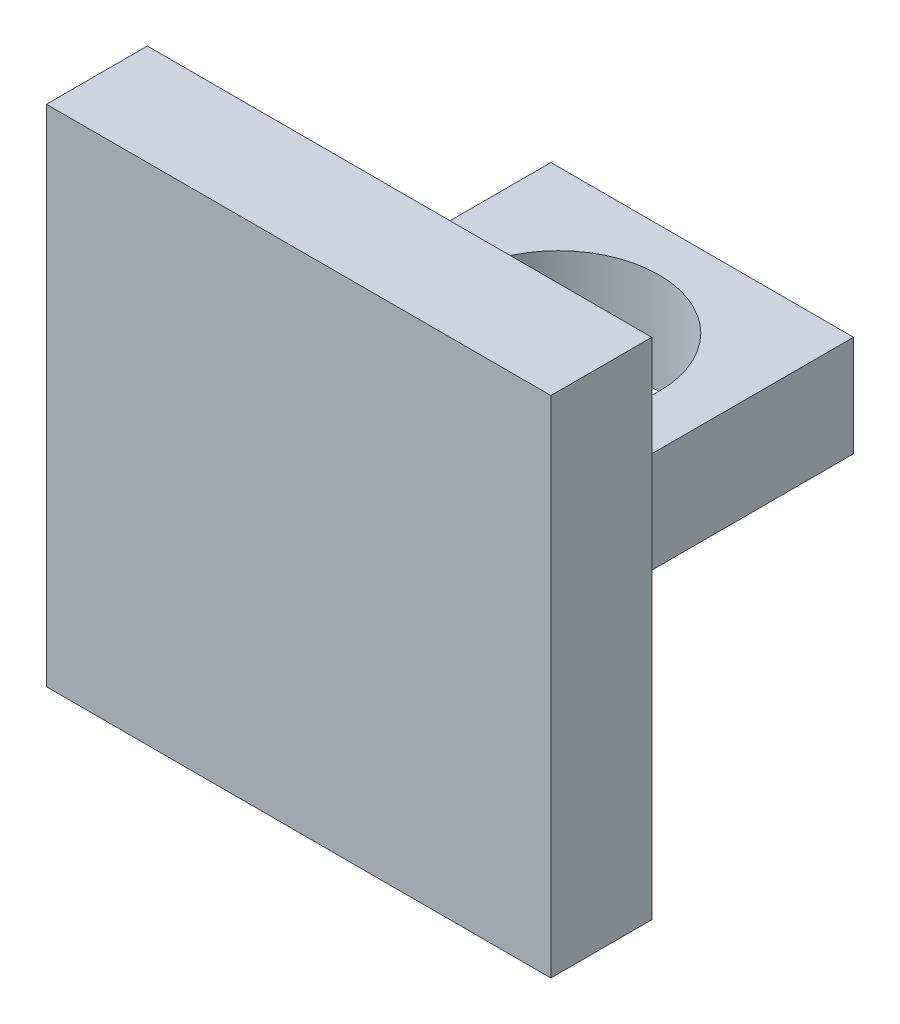
ISO-10303-21;
HEADER;
FILE_DESCRIPTION(('STEP AP214'),'2;1');
FILE_NAME('part.step','',(''),(''),'','','');
FILE_SCHEMA(('AUTOMOTIVE_DESIGN { 1 0 10303 214 1 1 1 1 }'));
ENDSEC;
DATA;
#1=APPLICATION_CONTEXT('core data for automotive mechanical design processes');
#2=APPLICATION_PROTOCOL_DEFINITION('international standard','automotive_design',2000,#1);
#3=PRODUCT_CONTEXT('',#1,'mechanical');
#4=PRODUCT('Part','Part','',(#3));
#5=PRODUCT_RELATED_PRODUCT_CATEGORY('part','',(#4));
#6=PRODUCT_DEFINITION_FORMATION('','',#4);
#7=PRODUCT_DEFINITION_CONTEXT('part definition',#1,'design');
#8=PRODUCT_DEFINITION('design','',#6,#7);
#9=PRODUCT_DEFINITION_SHAPE('','',#8);
#10=(LENGTH_UNIT() NAMED_UNIT(*) SI_UNIT(.MILLI.,.METRE.));
#11=(NAMED_UNIT(*) PLANE_ANGLE_UNIT() SI_UNIT($,.RADIAN.));
#12=(NAMED_UNIT(*) SI_UNIT($,.STERADIAN.) SOLID_ANGLE_UNIT());
#13=UNCERTAINTY_MEASURE_WITH_UNIT(LENGTH_MEASURE(1.E-05),#10,'distance_accuracy_value','');
#14=(GEOMETRIC_REPRESENTATION_CONTEXT(3) GLOBAL_UNCERTAINTY_ASSIGNED_CONTEXT((#13)) GLOBAL_UNIT_ASSIGNED_CONTEXT((#10,
#11,#12)) REPRESENTATION_CONTEXT('',''));
#15=CARTESIAN_POINT('',(0.,0.,0.));
#16=DIRECTION('',(0.,0.,1.));
#17=DIRECTION('',(1.,0.,0.));
#18=AXIS2_PLACEMENT_3D('',#15,#16,#17);
#19=CARTESIAN_POINT('',(-25.,25.,0.));
#20=DIRECTION('',(0.,0.,1.));
#21=DIRECTION('',(1.,0.,0.));
#22=AXIS2_PLACEMENT_3D('',#19,#20,#21);
#23=PLANE('',#22);
#24=DIRECTION('',(0.,-1.,0.));
#25=VECTOR('',#24,1.);
#26=CARTESIAN_POINT('',(-25.,-25.,0.));
#27=LINE('',#26,#25);
#28=CARTESIAN_POINT('',(-25.,25.,0.));
#29=VERTEX_POINT('',#28);
#30=CARTESIAN_POINT('',(-25.,-25.,0.));
#31=VERTEX_POINT('',#30);
#32=EDGE_CURVE('E118',#29,#31,#27,.T.);
#33=ORIENTED_EDGE('',*,*,#32,.F.);
#34=DIRECTION('',(-1.,0.,0.));
#35=VECTOR('',#34,1.);
#36=CARTESIAN_POINT('',(25.,25.,0.));
#37=LINE('',#36,#35);
#38=CARTESIAN_POINT('',(25.,25.,0.));
#39=VERTEX_POINT('',#38);
#40=EDGE_CURVE('E131',#39,#29,#37,.T.);
#41=ORIENTED_EDGE('',*,*,#40,.F.);
#42=DIRECTION('',(0.,1.,0.));
#43=VECTOR('',#42,1.);
#44=CARTESIAN_POINT('',(25.,-25.,0.));
#45=LINE('',#44,#43);
#46=CARTESIAN_POINT('',(25.,-25.,0.));
#47=VERTEX_POINT('',#46);
#48=EDGE_CURVE('E139',#47,#39,#45,.T.);
#49=ORIENTED_EDGE('',*,*,#48,.F.);
#50=DIRECTION('',(1.,0.,0.));
#51=VECTOR('',#50,1.);
#52=CARTESIAN_POINT('',(25.,-25.,0.));
#53=LINE('',#52,#51);
#54=EDGE_CURVE('E121',#31,#47,#53,.T.);
#55=ORIENTED_EDGE('',*,*,#54,.F.);
#56=EDGE_LOOP('',(#33,#41,#49,#55));
#57=FACE_BOUND('',#56,.T.);
#58=DIRECTION('',(0.,-1.,0.));
#59=VECTOR('',#58,1.);
#60=CARTESIAN_POINT('',(15.,-5.,0.));
#61=LINE('',#60,#59);
#62=CARTESIAN_POINT('',(15.,5.,0.));
#63=VERTEX_POINT('',#62);
#64=CARTESIAN_POINT('',(15.,-5.,0.));
#65=VERTEX_POINT('',#64);
#66=EDGE_CURVE('E117',#63,#65,#61,.T.);
#67=ORIENTED_EDGE('',*,*,#66,.F.);
#68=DIRECTION('',(1.,0.,0.));
#69=VECTOR('',#68,1.);
#70=CARTESIAN_POINT('',(-15.,5.,0.));
#71=LINE('',#70,#69);
#72=CARTESIAN_POINT('',(-15.,5.,0.));
#73=VERTEX_POINT('',#72);
#74=EDGE_CURVE('E114',#73,#63,#71,.T.);
#75=ORIENTED_EDGE('',*,*,#74,.F.);
#76=DIRECTION('',(0.,1.,0.));
#77=VECTOR('',#76,1.);
#78=CARTESIAN_POINT('',(-15.,-5.,0.));
#79=LINE('',#78,#77);
#80=CARTESIAN_POINT('',(-15.,-5.,0.));
#81=VERTEX_POINT('',#80);
#82=EDGE_CURVE('E52',#81,#73,#79,.T.);
#83=ORIENTED_EDGE('',*,*,#82,.F.);
#84=DIRECTION('',(-1.,0.,0.));
#85=VECTOR('',#84,1.);
#86=CARTESIAN_POINT('',(-15.,-5.,0.));
#87=LINE('',#86,#85);
#88=EDGE_CURVE('E47',#65,#81,#87,.T.);
#89=ORIENTED_EDGE('',*,*,#88,.F.);
#90=EDGE_LOOP('',(#67,#75,#83,#89));
#91=FACE_BOUND('',#90,.T.);
#92=ADVANCED_FACE('F32',(#57,#91),#23,.F.);
#93=CARTESIAN_POINT('',(-25.,-25.,10.));
#94=DIRECTION('',(1.,0.,0.));
#95=DIRECTION('',(0.,0.,-1.));
#96=AXIS2_PLACEMENT_3D('',#93,#94,#95);
#97=PLANE('',#96);
#98=ORIENTED_EDGE('',*,*,#32,.T.);
#99=DIRECTION('',(0.,0.,-1.));
#100=VECTOR('',#99,1.);
#101=CARTESIAN_POINT('',(-25.,-25.,10.));
#102=LINE('',#101,#100);
#103=CARTESIAN_POINT('',(-25.,-25.,10.));
#104=VERTEX_POINT('',#103);
#105=EDGE_CURVE('E11',#104,#31,#102,.T.);
#106=ORIENTED_EDGE('',*,*,#105,.F.);
#107=DIRECTION('',(0.,-1.,0.));
#108=VECTOR('',#107,1.);
#109=CARTESIAN_POINT('',(-25.,-25.,10.));
#110=LINE('',#109,#108);
#111=CARTESIAN_POINT('',(-25.,25.,10.));
#112=VERTEX_POINT('',#111);
#113=EDGE_CURVE('E127',#112,#104,#110,.T.);
#114=ORIENTED_EDGE('',*,*,#113,.F.);
#115=DIRECTION('',(0.,0.,-1.));
#116=VECTOR('',#115,1.);
#117=CARTESIAN_POINT('',(-25.,25.,10.));
#118=LINE('',#117,#116);
#119=EDGE_CURVE('E136',#112,#29,#118,.T.);
#120=ORIENTED_EDGE('',*,*,#119,.T.);
#121=EDGE_LOOP('',(#98,#106,#114,#120));
#122=FACE_BOUND('',#121,.T.);
#123=ADVANCED_FACE('F34',(#122),#97,.F.);
#124=CARTESIAN_POINT('',(25.,-25.,10.));
#125=DIRECTION('',(0.,1.,0.));
#126=DIRECTION('',(-1.,0.,0.));
#127=AXIS2_PLACEMENT_3D('',#124,#125,#126);
#128=PLANE('',#127);
#129=ORIENTED_EDGE('',*,*,#54,.T.);
#130=DIRECTION('',(0.,0.,-1.));
#131=VECTOR('',#130,1.);
#132=CARTESIAN_POINT('',(25.,-25.,10.));
#133=LINE('',#132,#131);
#134=CARTESIAN_POINT('',(25.,-25.,10.));
#135=VERTEX_POINT('',#134);
#136=EDGE_CURVE('E40',#135,#47,#133,.T.);
#137=ORIENTED_EDGE('',*,*,#136,.F.);
#138=DIRECTION('',(1.,0.,0.));
#139=VECTOR('',#138,1.);
#140=CARTESIAN_POINT('',(25.,-25.,10.));
#141=LINE('',#140,#139);
#142=EDGE_CURVE('E130',#104,#135,#141,.T.);
#143=ORIENTED_EDGE('',*,*,#142,.F.);
#144=ORIENTED_EDGE('',*,*,#105,.T.);
#145=EDGE_LOOP('',(#129,#137,#143,#144));
#146=FACE_BOUND('',#145,.T.);
#147=ADVANCED_FACE('F166',(#146),#128,.F.);
#148=CARTESIAN_POINT('',(25.,-25.,10.));
#149=DIRECTION('',(-1.,0.,0.));
#150=DIRECTION('',(0.,0.,1.));
#151=AXIS2_PLACEMENT_3D('',#148,#149,#150);
#152=PLANE('',#151);
#153=ORIENTED_EDGE('',*,*,#48,.T.);
#154=DIRECTION('',(0.,0.,-1.));
#155=VECTOR('',#154,1.);
#156=CARTESIAN_POINT('',(25.,25.,10.));
#157=LINE('',#156,#155);
#158=CARTESIAN_POINT('',(25.,25.,10.));
#159=VERTEX_POINT('',#158);
#160=EDGE_CURVE('E144',#159,#39,#157,.T.);
#161=ORIENTED_EDGE('',*,*,#160,.F.);
#162=DIRECTION('',(0.,1.,0.));
#163=VECTOR('',#162,1.);
#164=CARTESIAN_POINT('',(25.,-25.,10.));
#165=LINE('',#164,#163);
#166=EDGE_CURVE('E133',#135,#159,#165,.T.);
#167=ORIENTED_EDGE('',*,*,#166,.F.);
#168=ORIENTED_EDGE('',*,*,#136,.T.);
#169=EDGE_LOOP('',(#153,#161,#167,#168));
#170=FACE_BOUND('',#169,.T.);
#171=ADVANCED_FACE('F151',(#170),#152,.F.);
#172=CARTESIAN_POINT('',(25.,25.,10.));
#173=DIRECTION('',(0.,-1.,0.));
#174=DIRECTION('',(1.,0.,0.));
#175=AXIS2_PLACEMENT_3D('',#172,#173,#174);
#176=PLANE('',#175);
#177=ORIENTED_EDGE('',*,*,#40,.T.);
#178=ORIENTED_EDGE('',*,*,#119,.F.);
#179=DIRECTION('',(-1.,0.,0.));
#180=VECTOR('',#179,1.);
#181=CARTESIAN_POINT('',(25.,25.,10.));
#182=LINE('',#181,#180);
#183=EDGE_CURVE('E135',#159,#112,#182,.T.);
#184=ORIENTED_EDGE('',*,*,#183,.F.);
#185=ORIENTED_EDGE('',*,*,#160,.T.);
#186=EDGE_LOOP('',(#177,#178,#184,#185));
#187=FACE_BOUND('',#186,.T.);
#188=ADVANCED_FACE('F159',(#187),#176,.F.);
#189=CARTESIAN_POINT('',(-25.,25.,10.));
#190=DIRECTION('',(0.,0.,1.));
#191=DIRECTION('',(1.,0.,0.));
#192=AXIS2_PLACEMENT_3D('',#189,#190,#191);
#193=PLANE('',#192);
#194=ORIENTED_EDGE('',*,*,#113,.T.);
#195=ORIENTED_EDGE('',*,*,#142,.T.);
#196=ORIENTED_EDGE('',*,*,#166,.T.);
#197=ORIENTED_EDGE('',*,*,#183,.T.);
#198=EDGE_LOOP('',(#194,#195,#196,#197));
#199=FACE_BOUND('',#198,.T.);
#200=ADVANCED_FACE('F165',(#199),#193,.T.);
#201=CARTESIAN_POINT('',(15.,-5.,-30.));
#202=DIRECTION('',(-1.,0.,0.));
#203=DIRECTION('',(0.,0.,1.));
#204=AXIS2_PLACEMENT_3D('',#201,#202,#203);
#205=PLANE('',#204);
#206=ORIENTED_EDGE('',*,*,#66,.T.);
#207=DIRECTION('',(0.,0.,1.));
#208=VECTOR('',#207,1.);
#209=CARTESIAN_POINT('',(15.,-5.,-30.));
#210=LINE('',#209,#208);
#211=CARTESIAN_POINT('',(15.,-5.,-30.));
#212=VERTEX_POINT('',#211);
#213=EDGE_CURVE('E98',#212,#65,#210,.T.);
#214=ORIENTED_EDGE('',*,*,#213,.F.);
#215=DIRECTION('',(0.,-1.,0.));
#216=VECTOR('',#215,1.);
#217=CARTESIAN_POINT('',(15.,-5.,-30.));
#218=LINE('',#217,#216);
#219=CARTESIAN_POINT('',(15.,5.,-30.));
#220=VERTEX_POINT('',#219);
#221=EDGE_CURVE('E105',#220,#212,#218,.T.);
#222=ORIENTED_EDGE('',*,*,#221,.F.);
#223=DIRECTION('',(0.,0.,1.));
#224=VECTOR('',#223,1.);
#225=CARTESIAN_POINT('',(15.,5.,-30.));
#226=LINE('',#225,#224);
#227=EDGE_CURVE('E220',#220,#63,#226,.T.);
#228=ORIENTED_EDGE('',*,*,#227,.T.);
#229=EDGE_LOOP('',(#206,#214,#222,#228));
#230=FACE_BOUND('',#229,.T.);
#231=ADVANCED_FACE('F116',(#230),#205,.F.);
#232=CARTESIAN_POINT('',(-15.,-5.,-30.));
#233=DIRECTION('',(0.,1.,0.));
#234=DIRECTION('',(-1.,0.,0.));
#235=AXIS2_PLACEMENT_3D('',#232,#233,#234);
#236=PLANE('',#235);
#237=CARTESIAN_POINT('',(0.,-5.,-15.7171339634915));
#238=DIRECTION('',(0.,1.,0.));
#239=DIRECTION('',(-1.,0.,0.));
#240=AXIS2_PLACEMENT_3D('',#237,#238,#239);
#241=CIRCLE('',#240,10.);
#242=CARTESIAN_POINT('',(-10.,-5.,-15.7171339634915));
#243=VERTEX_POINT('',#242);
#244=EDGE_CURVE('E214',#243,#243,#241,.T.);
#245=ORIENTED_EDGE('',*,*,#244,.T.);
#246=EDGE_LOOP('',(#245));
#247=FACE_BOUND('',#246,.T.);
#248=ORIENTED_EDGE('',*,*,#88,.T.);
#249=DIRECTION('',(0.,0.,1.));
#250=VECTOR('',#249,1.);
#251=CARTESIAN_POINT('',(-15.,-5.,-30.));
#252=LINE('',#251,#250);
#253=CARTESIAN_POINT('',(-15.,-5.,-30.));
#254=VERTEX_POINT('',#253);
#255=EDGE_CURVE('E101',#254,#81,#252,.T.);
#256=ORIENTED_EDGE('',*,*,#255,.F.);
#257=DIRECTION('',(-1.,0.,0.));
#258=VECTOR('',#257,1.);
#259=CARTESIAN_POINT('',(-15.,-5.,-30.));
#260=LINE('',#259,#258);
#261=EDGE_CURVE('E94',#212,#254,#260,.T.);
#262=ORIENTED_EDGE('',*,*,#261,.F.);
#263=ORIENTED_EDGE('',*,*,#213,.T.);
#264=EDGE_LOOP('',(#248,#256,#262,#263));
#265=FACE_BOUND('',#264,.T.);
#266=ADVANCED_FACE('F96',(#247,#265),#236,.F.);
#267=CARTESIAN_POINT('',(-15.,-5.,-30.));
#268=DIRECTION('',(1.,0.,0.));
#269=DIRECTION('',(0.,0.,-1.));
#270=AXIS2_PLACEMENT_3D('',#267,#268,#269);
#271=PLANE('',#270);
#272=ORIENTED_EDGE('',*,*,#82,.T.);
#273=DIRECTION('',(0.,0.,1.));
#274=VECTOR('',#273,1.);
#275=CARTESIAN_POINT('',(-15.,5.,-30.));
#276=LINE('',#275,#274);
#277=CARTESIAN_POINT('',(-15.,5.,-30.));
#278=VERTEX_POINT('',#277);
#279=EDGE_CURVE('E123',#278,#73,#276,.T.);
#280=ORIENTED_EDGE('',*,*,#279,.F.);
#281=DIRECTION('',(0.,1.,0.));
#282=VECTOR('',#281,1.);
#283=CARTESIAN_POINT('',(-15.,-5.,-30.));
#284=LINE('',#283,#282);
#285=EDGE_CURVE('E104',#254,#278,#284,.T.);
#286=ORIENTED_EDGE('',*,*,#285,.F.);
#287=ORIENTED_EDGE('',*,*,#255,.T.);
#288=EDGE_LOOP('',(#272,#280,#286,#287));
#289=FACE_BOUND('',#288,.T.);
#290=ADVANCED_FACE('F190',(#289),#271,.F.);
#291=CARTESIAN_POINT('',(-15.,5.,-30.));
#292=DIRECTION('',(0.,-1.,0.));
#293=DIRECTION('',(1.,0.,0.));
#294=AXIS2_PLACEMENT_3D('',#291,#292,#293);
#295=PLANE('',#294);
#296=CARTESIAN_POINT('',(0.,5.,-15.7171339634915));
#297=DIRECTION('',(0.,1.,0.));
#298=DIRECTION('',(-1.,0.,0.));
#299=AXIS2_PLACEMENT_3D('',#296,#297,#298);
#300=CIRCLE('',#299,10.);
#301=CARTESIAN_POINT('',(-10.,5.,-15.7171339634915));
#302=VERTEX_POINT('',#301);
#303=EDGE_CURVE('E211',#302,#302,#300,.T.);
#304=ORIENTED_EDGE('',*,*,#303,.F.);
#305=EDGE_LOOP('',(#304));
#306=FACE_BOUND('',#305,.T.);
#307=ORIENTED_EDGE('',*,*,#74,.T.);
#308=ORIENTED_EDGE('',*,*,#227,.F.);
#309=DIRECTION('',(1.,0.,0.));
#310=VECTOR('',#309,1.);
#311=CARTESIAN_POINT('',(-15.,5.,-30.));
#312=LINE('',#311,#310);
#313=EDGE_CURVE('E110',#278,#220,#312,.T.);
#314=ORIENTED_EDGE('',*,*,#313,.F.);
#315=ORIENTED_EDGE('',*,*,#279,.T.);
#316=EDGE_LOOP('',(#307,#308,#314,#315));
#317=FACE_BOUND('',#316,.T.);
#318=ADVANCED_FACE('F196',(#306,#317),#295,.F.);
#319=CARTESIAN_POINT('',(15.,5.,-30.));
#320=DIRECTION('',(0.,0.,-1.));
#321=DIRECTION('',(-1.,0.,0.));
#322=AXIS2_PLACEMENT_3D('',#319,#320,#321);
#323=PLANE('',#322);
#324=ORIENTED_EDGE('',*,*,#221,.T.);
#325=ORIENTED_EDGE('',*,*,#261,.T.);
#326=ORIENTED_EDGE('',*,*,#285,.T.);
#327=ORIENTED_EDGE('',*,*,#313,.T.);
#328=EDGE_LOOP('',(#324,#325,#326,#327));
#329=FACE_BOUND('',#328,.T.);
#330=ADVANCED_FACE('F108',(#329),#323,.T.);
#331=CARTESIAN_POINT('',(0.,-25.,-15.7171339634915));
#332=DIRECTION('',(0.,1.,0.));
#333=DIRECTION('',(-1.,0.,0.));
#334=AXIS2_PLACEMENT_3D('',#331,#332,#333);
#335=CYLINDRICAL_SURFACE('',#334,10.);
#336=ORIENTED_EDGE('',*,*,#303,.T.);
#337=EDGE_LOOP('',(#336));
#338=FACE_BOUND('',#337,.T.);
#339=ORIENTED_EDGE('',*,*,#244,.F.);
#340=EDGE_LOOP('',(#339));
#341=FACE_BOUND('',#340,.T.);
#342=ADVANCED_FACE('F203',(#338,#341),#335,.F.);
#343=CLOSED_SHELL('',(#92,#123,#147,#171,#188,#200,#231,#266,#290,#318,#330,#342));
#344=MANIFOLD_SOLID_BREP('B2',#343);
#345=ADVANCED_BREP_SHAPE_REPRESENTATION('',(#18,#344),#14);
#346=SHAPE_DEFINITION_REPRESENTATION(#9,#345);
ENDSEC;
END-ISO-10303-21;
